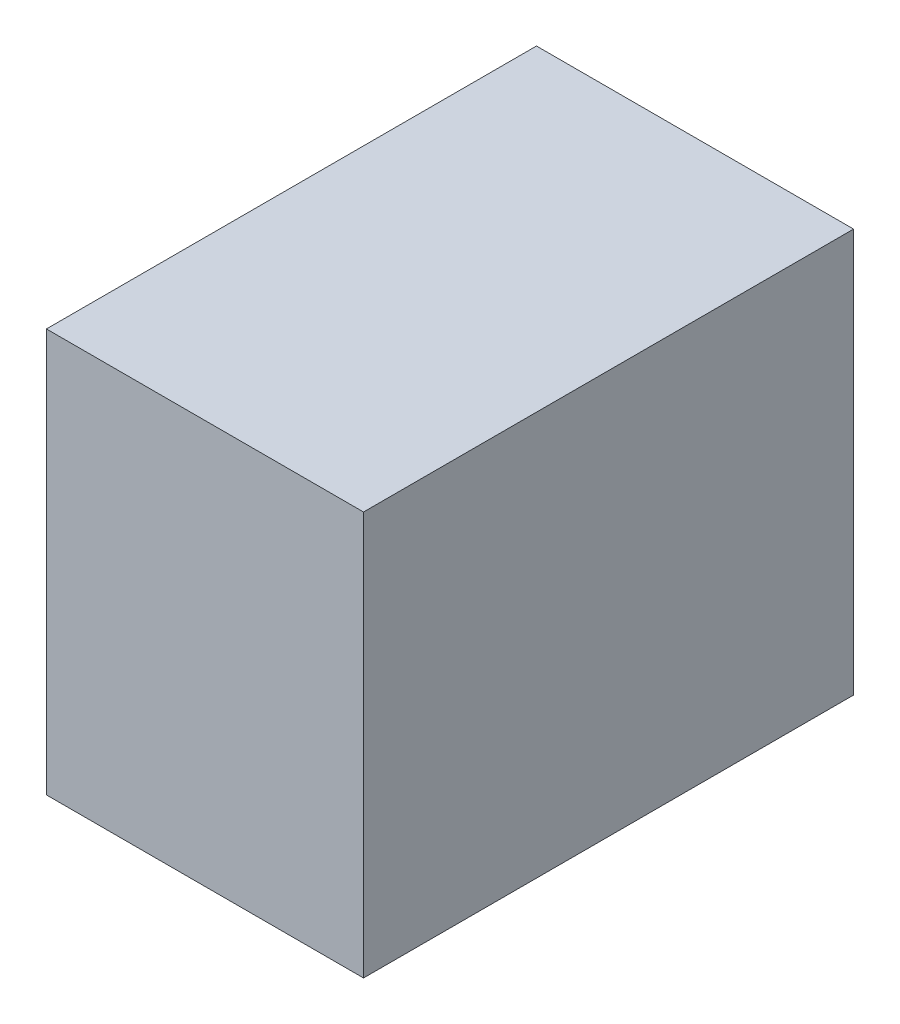
ISO-10303-21;
HEADER;
FILE_DESCRIPTION(('STEP AP214'),'2;1');
FILE_NAME('part.step','',(''),(''),'','','');
FILE_SCHEMA(('AUTOMOTIVE_DESIGN { 1 0 10303 214 1 1 1 1 }'));
ENDSEC;
DATA;
#1=APPLICATION_CONTEXT('core data for automotive mechanical design processes');
#2=APPLICATION_PROTOCOL_DEFINITION('international standard','automotive_design',2000,#1);
#3=PRODUCT_CONTEXT('',#1,'mechanical');
#4=PRODUCT('Part','Part','',(#3));
#5=PRODUCT_RELATED_PRODUCT_CATEGORY('part','',(#4));
#6=PRODUCT_DEFINITION_FORMATION('','',#4);
#7=PRODUCT_DEFINITION_CONTEXT('part definition',#1,'design');
#8=PRODUCT_DEFINITION('design','',#6,#7);
#9=PRODUCT_DEFINITION_SHAPE('','',#8);
#10=(LENGTH_UNIT() NAMED_UNIT(*) SI_UNIT(.MILLI.,.METRE.));
#11=(NAMED_UNIT(*) PLANE_ANGLE_UNIT() SI_UNIT($,.RADIAN.));
#12=(NAMED_UNIT(*) SI_UNIT($,.STERADIAN.) SOLID_ANGLE_UNIT());
#13=UNCERTAINTY_MEASURE_WITH_UNIT(LENGTH_MEASURE(1.E-05),#10,'distance_accuracy_value','');
#14=(GEOMETRIC_REPRESENTATION_CONTEXT(3) GLOBAL_UNCERTAINTY_ASSIGNED_CONTEXT((#13)) GLOBAL_UNIT_ASSIGNED_CONTEXT((#10,
#11,#12)) REPRESENTATION_CONTEXT('',''));
#15=CARTESIAN_POINT('',(0.,0.,0.));
#16=DIRECTION('',(0.,0.,1.));
#17=DIRECTION('',(1.,0.,0.));
#18=AXIS2_PLACEMENT_3D('',#15,#16,#17);
#19=CARTESIAN_POINT('',(27.5,70.,42.5));
#20=DIRECTION('',(-1.,0.,0.));
#21=DIRECTION('',(0.,0.,1.));
#22=AXIS2_PLACEMENT_3D('',#19,#20,#21);
#23=PLANE('',#22);
#24=DIRECTION('',(0.,0.,-1.));
#25=VECTOR('',#24,1.);
#26=CARTESIAN_POINT('',(27.5,0.,42.5));
#27=LINE('',#26,#25);
#28=CARTESIAN_POINT('',(27.5,0.,42.5));
#29=VERTEX_POINT('',#28);
#30=CARTESIAN_POINT('',(27.5,0.,-42.5));
#31=VERTEX_POINT('',#30);
#32=EDGE_CURVE('E105',#29,#31,#27,.T.);
#33=ORIENTED_EDGE('',*,*,#32,.T.);
#34=DIRECTION('',(0.,-1.,0.));
#35=VECTOR('',#34,1.);
#36=CARTESIAN_POINT('',(27.5,70.,-42.5));
#37=LINE('',#36,#35);
#38=CARTESIAN_POINT('',(27.5,70.,-42.5));
#39=VERTEX_POINT('',#38);
#40=EDGE_CURVE('E11',#39,#31,#37,.T.);
#41=ORIENTED_EDGE('',*,*,#40,.F.);
#42=DIRECTION('',(0.,0.,-1.));
#43=VECTOR('',#42,1.);
#44=CARTESIAN_POINT('',(27.5,70.,42.5));
#45=LINE('',#44,#43);
#46=CARTESIAN_POINT('',(27.5,70.,42.5));
#47=VERTEX_POINT('',#46);
#48=EDGE_CURVE('E93',#47,#39,#45,.T.);
#49=ORIENTED_EDGE('',*,*,#48,.F.);
#50=DIRECTION('',(0.,-1.,0.));
#51=VECTOR('',#50,1.);
#52=CARTESIAN_POINT('',(27.5,70.,42.5));
#53=LINE('',#52,#51);
#54=EDGE_CURVE('E101',#47,#29,#53,.T.);
#55=ORIENTED_EDGE('',*,*,#54,.T.);
#56=EDGE_LOOP('',(#33,#41,#49,#55));
#57=FACE_BOUND('',#56,.T.);
#58=ADVANCED_FACE('F42',(#57),#23,.F.);
#59=CARTESIAN_POINT('',(-27.5,70.,-42.5));
#60=DIRECTION('',(0.,0.,1.));
#61=DIRECTION('',(1.,0.,0.));
#62=AXIS2_PLACEMENT_3D('',#59,#60,#61);
#63=PLANE('',#62);
#64=DIRECTION('',(-1.,0.,0.));
#65=VECTOR('',#64,1.);
#66=CARTESIAN_POINT('',(-27.5,0.,-42.5));
#67=LINE('',#66,#65);
#68=CARTESIAN_POINT('',(-27.5,0.,-42.5));
#69=VERTEX_POINT('',#68);
#70=EDGE_CURVE('E97',#31,#69,#67,.T.);
#71=ORIENTED_EDGE('',*,*,#70,.T.);
#72=DIRECTION('',(0.,-1.,0.));
#73=VECTOR('',#72,1.);
#74=CARTESIAN_POINT('',(-27.5,70.,-42.5));
#75=LINE('',#74,#73);
#76=CARTESIAN_POINT('',(-27.5,70.,-42.5));
#77=VERTEX_POINT('',#76);
#78=EDGE_CURVE('E50',#77,#69,#75,.T.);
#79=ORIENTED_EDGE('',*,*,#78,.F.);
#80=DIRECTION('',(-1.,0.,0.));
#81=VECTOR('',#80,1.);
#82=CARTESIAN_POINT('',(-27.5,70.,-42.5));
#83=LINE('',#82,#81);
#84=EDGE_CURVE('E88',#39,#77,#83,.T.);
#85=ORIENTED_EDGE('',*,*,#84,.F.);
#86=ORIENTED_EDGE('',*,*,#40,.T.);
#87=EDGE_LOOP('',(#71,#79,#85,#86));
#88=FACE_BOUND('',#87,.T.);
#89=ADVANCED_FACE('F96',(#88),#63,.F.);
#90=CARTESIAN_POINT('',(-27.5,70.,42.5));
#91=DIRECTION('',(1.,0.,0.));
#92=DIRECTION('',(0.,0.,-1.));
#93=AXIS2_PLACEMENT_3D('',#90,#91,#92);
#94=PLANE('',#93);
#95=DIRECTION('',(0.,0.,1.));
#96=VECTOR('',#95,1.);
#97=CARTESIAN_POINT('',(-27.5,0.,42.5));
#98=LINE('',#97,#96);
#99=CARTESIAN_POINT('',(-27.5,0.,42.5));
#100=VERTEX_POINT('',#99);
#101=EDGE_CURVE('E75',#69,#100,#98,.T.);
#102=ORIENTED_EDGE('',*,*,#101,.T.);
#103=DIRECTION('',(0.,-1.,0.));
#104=VECTOR('',#103,1.);
#105=CARTESIAN_POINT('',(-27.5,70.,42.5));
#106=LINE('',#105,#104);
#107=CARTESIAN_POINT('',(-27.5,70.,42.5));
#108=VERTEX_POINT('',#107);
#109=EDGE_CURVE('E98',#108,#100,#106,.T.);
#110=ORIENTED_EDGE('',*,*,#109,.F.);
#111=DIRECTION('',(0.,0.,1.));
#112=VECTOR('',#111,1.);
#113=CARTESIAN_POINT('',(-27.5,70.,42.5));
#114=LINE('',#113,#112);
#115=EDGE_CURVE('E91',#77,#108,#114,.T.);
#116=ORIENTED_EDGE('',*,*,#115,.F.);
#117=ORIENTED_EDGE('',*,*,#78,.T.);
#118=EDGE_LOOP('',(#102,#110,#116,#117));
#119=FACE_BOUND('',#118,.T.);
#120=ADVANCED_FACE('F99',(#119),#94,.F.);
#121=CARTESIAN_POINT('',(-27.5,70.,42.5));
#122=DIRECTION('',(0.,0.,-1.));
#123=DIRECTION('',(-1.,0.,0.));
#124=AXIS2_PLACEMENT_3D('',#121,#122,#123);
#125=PLANE('',#124);
#126=DIRECTION('',(1.,0.,0.));
#127=VECTOR('',#126,1.);
#128=CARTESIAN_POINT('',(-27.5,0.,42.5));
#129=LINE('',#128,#127);
#130=EDGE_CURVE('E81',#100,#29,#129,.T.);
#131=ORIENTED_EDGE('',*,*,#130,.T.);
#132=ORIENTED_EDGE('',*,*,#54,.F.);
#133=DIRECTION('',(1.,0.,0.));
#134=VECTOR('',#133,1.);
#135=CARTESIAN_POINT('',(-27.5,70.,42.5));
#136=LINE('',#135,#134);
#137=EDGE_CURVE('E58',#108,#47,#136,.T.);
#138=ORIENTED_EDGE('',*,*,#137,.F.);
#139=ORIENTED_EDGE('',*,*,#109,.T.);
#140=EDGE_LOOP('',(#131,#132,#138,#139));
#141=FACE_BOUND('',#140,.T.);
#142=ADVANCED_FACE('F112',(#141),#125,.F.);
#143=CARTESIAN_POINT('',(0.,70.,0.));
#144=DIRECTION('',(0.,-1.,0.));
#145=DIRECTION('',(0.,0.,-1.));
#146=AXIS2_PLACEMENT_3D('',#143,#144,#145);
#147=PLANE('',#146);
#148=ORIENTED_EDGE('',*,*,#48,.T.);
#149=ORIENTED_EDGE('',*,*,#84,.T.);
#150=ORIENTED_EDGE('',*,*,#115,.T.);
#151=ORIENTED_EDGE('',*,*,#137,.T.);
#152=EDGE_LOOP('',(#148,#149,#150,#151));
#153=FACE_BOUND('',#152,.T.);
#154=ADVANCED_FACE('F89',(#153),#147,.F.);
#155=CARTESIAN_POINT('',(0.,0.,0.));
#156=DIRECTION('',(0.,-1.,0.));
#157=DIRECTION('',(0.,0.,-1.));
#158=AXIS2_PLACEMENT_3D('',#155,#156,#157);
#159=PLANE('',#158);
#160=ORIENTED_EDGE('',*,*,#32,.F.);
#161=ORIENTED_EDGE('',*,*,#130,.F.);
#162=ORIENTED_EDGE('',*,*,#101,.F.);
#163=ORIENTED_EDGE('',*,*,#70,.F.);
#164=EDGE_LOOP('',(#160,#161,#162,#163));
#165=FACE_BOUND('',#164,.T.);
#166=ADVANCED_FACE('F115',(#165),#159,.T.);
#167=CLOSED_SHELL('',(#58,#89,#120,#142,#154,#166));
#168=MANIFOLD_SOLID_BREP('B2',#167);
#169=ADVANCED_BREP_SHAPE_REPRESENTATION('',(#18,#168),#14);
#170=SHAPE_DEFINITION_REPRESENTATION(#9,#169);
ENDSEC;
END-ISO-10303-21;
